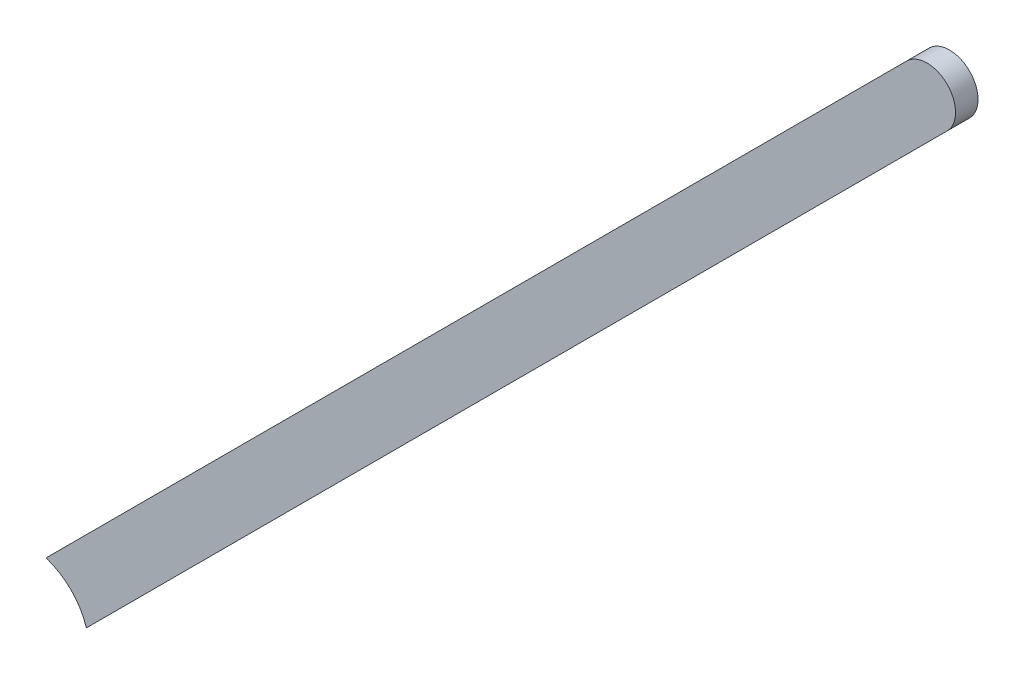
ISO-10303-21;
HEADER;
FILE_DESCRIPTION(('STEP AP214'),'2;1');
FILE_NAME('part.step','',(''),(''),'','','');
FILE_SCHEMA(('AUTOMOTIVE_DESIGN { 1 0 10303 214 1 1 1 1 }'));
ENDSEC;
DATA;
#1=APPLICATION_CONTEXT('core data for automotive mechanical design processes');
#2=APPLICATION_PROTOCOL_DEFINITION('international standard','automotive_design',2000,#1);
#3=PRODUCT_CONTEXT('',#1,'mechanical');
#4=PRODUCT('Part','Part','',(#3));
#5=PRODUCT_RELATED_PRODUCT_CATEGORY('part','',(#4));
#6=PRODUCT_DEFINITION_FORMATION('','',#4);
#7=PRODUCT_DEFINITION_CONTEXT('part definition',#1,'design');
#8=PRODUCT_DEFINITION('design','',#6,#7);
#9=PRODUCT_DEFINITION_SHAPE('','',#8);
#10=(LENGTH_UNIT() NAMED_UNIT(*) SI_UNIT(.MILLI.,.METRE.));
#11=(NAMED_UNIT(*) PLANE_ANGLE_UNIT() SI_UNIT($,.RADIAN.));
#12=(NAMED_UNIT(*) SI_UNIT($,.STERADIAN.) SOLID_ANGLE_UNIT());
#13=UNCERTAINTY_MEASURE_WITH_UNIT(LENGTH_MEASURE(1.E-05),#10,'distance_accuracy_value','');
#14=(GEOMETRIC_REPRESENTATION_CONTEXT(3) GLOBAL_UNCERTAINTY_ASSIGNED_CONTEXT((#13)) GLOBAL_UNIT_ASSIGNED_CONTEXT((#10,
#11,#12)) REPRESENTATION_CONTEXT('',''));
#15=CARTESIAN_POINT('',(0.,0.,0.));
#16=DIRECTION('',(0.,0.,1.));
#17=DIRECTION('',(1.,0.,0.));
#18=AXIS2_PLACEMENT_3D('',#15,#16,#17);
#19=CARTESIAN_POINT('',(94.3815384048469,93.6383318648469,0.));
#20=DIRECTION('',(-0.707106781186547,0.707106781186548,0.));
#21=DIRECTION('',(0.707106781186548,0.707106781186547,0.));
#22=AXIS2_PLACEMENT_3D('',#19,#20,#21);
#23=PLANE('',#22);
#24=DIRECTION('',(0.707106781186548,0.707106781186547,0.));
#25=VECTOR('',#24,1.);
#26=CARTESIAN_POINT('',(94.03260594,93.2893994,0.1999996));
#27=LINE('',#26,#25);
#28=CARTESIAN_POINT('',(94.3815384048469,93.6383318648469,0.1999996));
#29=VERTEX_POINT('',#28);
#30=CARTESIAN_POINT('',(102.0336034,101.29039686,0.1999996));
#31=VERTEX_POINT('',#30);
#32=EDGE_CURVE('E11',#29,#31,#27,.T.);
#33=ORIENTED_EDGE('',*,*,#32,.F.);
#34=DIRECTION('',(0.,0.,1.));
#35=VECTOR('',#34,1.);
#36=CARTESIAN_POINT('',(94.3815384048469,93.6383318648469,0.));
#37=LINE('',#36,#35);
#38=CARTESIAN_POINT('',(94.3815384048469,93.6383318648469,0.));
#39=VERTEX_POINT('',#38);
#40=EDGE_CURVE('E24',#39,#29,#37,.T.);
#41=ORIENTED_EDGE('',*,*,#40,.F.);
#42=DIRECTION('',(0.707106781186548,0.707106781186547,0.));
#43=VECTOR('',#42,1.);
#44=CARTESIAN_POINT('',(94.03260594,93.2893994,0.));
#45=LINE('',#44,#43);
#46=CARTESIAN_POINT('',(102.0336034,101.29039686,0.));
#47=VERTEX_POINT('',#46);
#48=EDGE_CURVE('E75',#39,#47,#45,.T.);
#49=ORIENTED_EDGE('',*,*,#48,.T.);
#50=DIRECTION('',(0.,0.,1.));
#51=VECTOR('',#50,1.);
#52=CARTESIAN_POINT('',(102.0336034,101.29039686,0.));
#53=LINE('',#52,#51);
#54=EDGE_CURVE('E37',#47,#31,#53,.T.);
#55=ORIENTED_EDGE('',*,*,#54,.T.);
#56=EDGE_LOOP('',(#33,#41,#49,#55));
#57=FACE_BOUND('',#56,.T.);
#58=ADVANCED_FACE('F17',(#57),#23,.F.);
#59=CARTESIAN_POINT('',(101.85399873,101.47000153,0.));
#60=DIRECTION('',(0.,0.,-1.));
#61=DIRECTION('',(0.707106781186548,-0.707106781186548,0.));
#62=AXIS2_PLACEMENT_3D('',#59,#60,#61);
#63=CYLINDRICAL_SURFACE('',#62,0.253999360179549);
#64=CARTESIAN_POINT('',(101.85399873,101.47000153,0.1999996));
#65=DIRECTION('',(0.,0.,1.));
#66=DIRECTION('',(0.707106781186548,-0.707106781186548,0.));
#67=AXIS2_PLACEMENT_3D('',#64,#65,#66);
#68=CIRCLE('',#67,0.253999360179549);
#69=CARTESIAN_POINT('',(101.67439406,101.6496062,0.1999996));
#70=VERTEX_POINT('',#69);
#71=EDGE_CURVE('E83',#31,#70,#68,.T.);
#72=ORIENTED_EDGE('',*,*,#71,.F.);
#73=ORIENTED_EDGE('',*,*,#54,.F.);
#74=CARTESIAN_POINT('',(101.85399873,101.47000153,0.));
#75=DIRECTION('',(0.,0.,1.));
#76=DIRECTION('',(0.707106781186548,-0.707106781186548,0.));
#77=AXIS2_PLACEMENT_3D('',#74,#75,#76);
#78=CIRCLE('',#77,0.253999360179549);
#79=CARTESIAN_POINT('',(101.67439406,101.6496062,0.));
#80=VERTEX_POINT('',#79);
#81=EDGE_CURVE('E81',#47,#80,#78,.T.);
#82=ORIENTED_EDGE('',*,*,#81,.T.);
#83=DIRECTION('',(0.,0.,1.));
#84=VECTOR('',#83,1.);
#85=CARTESIAN_POINT('',(101.67439406,101.6496062,0.));
#86=LINE('',#85,#84);
#87=EDGE_CURVE('E67',#80,#70,#86,.T.);
#88=ORIENTED_EDGE('',*,*,#87,.T.);
#89=EDGE_LOOP('',(#72,#73,#82,#88));
#90=FACE_BOUND('',#89,.T.);
#91=ADVANCED_FACE('F89',(#90),#63,.T.);
#92=CARTESIAN_POINT('',(101.67439406,101.6496062,0.));
#93=DIRECTION('',(0.707106781186548,-0.707106781186548,0.));
#94=DIRECTION('',(-0.707106781186548,-0.707106781186548,0.));
#95=AXIS2_PLACEMENT_3D('',#92,#93,#94);
#96=PLANE('',#95);
#97=DIRECTION('',(-0.707106781186548,-0.707106781186548,0.));
#98=VECTOR('',#97,1.);
#99=CARTESIAN_POINT('',(101.67439406,101.6496062,0.1999996));
#100=LINE('',#99,#98);
#101=CARTESIAN_POINT('',(94.0223290648469,93.9975412048469,0.1999996));
#102=VERTEX_POINT('',#101);
#103=EDGE_CURVE('E71',#70,#102,#100,.T.);
#104=ORIENTED_EDGE('',*,*,#103,.F.);
#105=ORIENTED_EDGE('',*,*,#87,.F.);
#106=DIRECTION('',(-0.707106781186548,-0.707106781186548,0.));
#107=VECTOR('',#106,1.);
#108=CARTESIAN_POINT('',(101.67439406,101.6496062,0.));
#109=LINE('',#108,#107);
#110=CARTESIAN_POINT('',(94.0223290648469,93.9975412048469,0.));
#111=VERTEX_POINT('',#110);
#112=EDGE_CURVE('E63',#80,#111,#109,.T.);
#113=ORIENTED_EDGE('',*,*,#112,.T.);
#114=DIRECTION('',(0.,0.,1.));
#115=VECTOR('',#114,1.);
#116=CARTESIAN_POINT('',(94.0223290648469,93.9975412048469,0.));
#117=LINE('',#116,#115);
#118=EDGE_CURVE('E53',#111,#102,#117,.T.);
#119=ORIENTED_EDGE('',*,*,#118,.T.);
#120=EDGE_LOOP('',(#104,#105,#113,#119));
#121=FACE_BOUND('',#120,.T.);
#122=ADVANCED_FACE('F66',(#121),#96,.F.);
#123=CARTESIAN_POINT('',(93.853,93.4690028,0.));
#124=DIRECTION('',(0.,0.,-1.));
#125=DIRECTION('',(1.,0.,0.));
#126=AXIS2_PLACEMENT_3D('',#123,#124,#125);
#127=CYLINDRICAL_SURFACE('',#126,0.55500016);
#128=ORIENTED_EDGE('',*,*,#40,.T.);
#129=CARTESIAN_POINT('',(93.853,93.4690028,0.1999996));
#130=DIRECTION('',(0.,0.,1.));
#131=DIRECTION('',(1.,0.,0.));
#132=AXIS2_PLACEMENT_3D('',#129,#130,#131);
#133=CIRCLE('',#132,0.55500016);
#134=EDGE_CURVE('E59',#29,#102,#133,.T.);
#135=ORIENTED_EDGE('',*,*,#134,.T.);
#136=ORIENTED_EDGE('',*,*,#118,.F.);
#137=CARTESIAN_POINT('',(93.853,93.4690028,0.));
#138=DIRECTION('',(0.,0.,1.));
#139=DIRECTION('',(1.,0.,0.));
#140=AXIS2_PLACEMENT_3D('',#137,#138,#139);
#141=CIRCLE('',#140,0.55500016);
#142=EDGE_CURVE('E57',#39,#111,#141,.T.);
#143=ORIENTED_EDGE('',*,*,#142,.F.);
#144=EDGE_LOOP('',(#128,#135,#136,#143));
#145=FACE_BOUND('',#144,.T.);
#146=ADVANCED_FACE('F55',(#145),#127,.F.);
#147=CARTESIAN_POINT('',(94.03260594,93.2893994,0.));
#148=DIRECTION('',(0.,0.,-1.));
#149=DIRECTION('',(-1.,0.,0.));
#150=AXIS2_PLACEMENT_3D('',#147,#148,#149);
#151=PLANE('',#150);
#152=ORIENTED_EDGE('',*,*,#48,.F.);
#153=ORIENTED_EDGE('',*,*,#142,.T.);
#154=ORIENTED_EDGE('',*,*,#112,.F.);
#155=ORIENTED_EDGE('',*,*,#81,.F.);
#156=EDGE_LOOP('',(#152,#153,#154,#155));
#157=FACE_BOUND('',#156,.T.);
#158=ADVANCED_FACE('F74',(#157),#151,.T.);
#159=CARTESIAN_POINT('',(94.03260594,93.2893994,0.1999996));
#160=DIRECTION('',(0.,0.,-1.));
#161=DIRECTION('',(-1.,0.,0.));
#162=AXIS2_PLACEMENT_3D('',#159,#160,#161);
#163=PLANE('',#162);
#164=ORIENTED_EDGE('',*,*,#134,.F.);
#165=ORIENTED_EDGE('',*,*,#32,.T.);
#166=ORIENTED_EDGE('',*,*,#71,.T.);
#167=ORIENTED_EDGE('',*,*,#103,.T.);
#168=EDGE_LOOP('',(#164,#165,#166,#167));
#169=FACE_BOUND('',#168,.T.);
#170=ADVANCED_FACE('F91',(#169),#163,.F.);
#171=CLOSED_SHELL('',(#58,#91,#122,#146,#158,#170));
#172=MANIFOLD_SOLID_BREP('B1',#171);
#173=ADVANCED_BREP_SHAPE_REPRESENTATION('',(#18,#172),#14);
#174=SHAPE_DEFINITION_REPRESENTATION(#9,#173);
ENDSEC;
END-ISO-10303-21;
